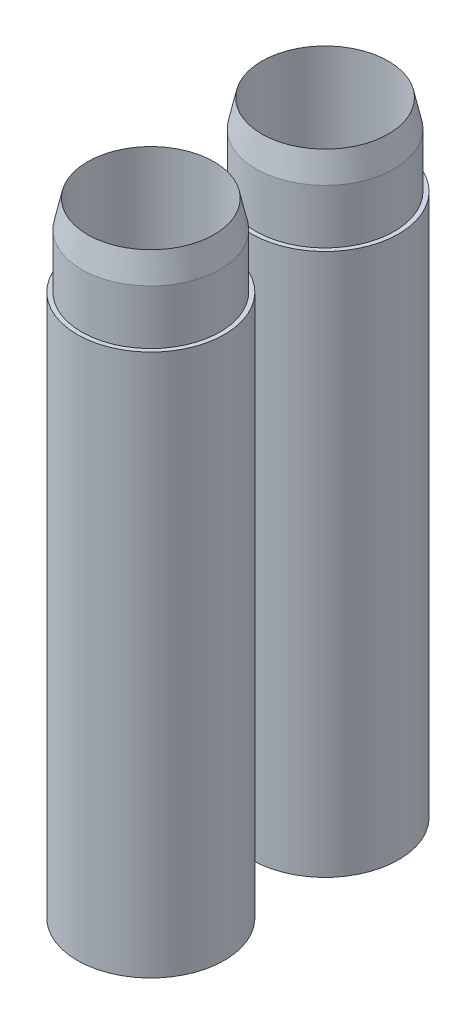
ISO-10303-21;
HEADER;
FILE_DESCRIPTION(('STEP AP214'),'2;1');
FILE_NAME('part.step','',(''),(''),'','','');
FILE_SCHEMA(('AUTOMOTIVE_DESIGN { 1 0 10303 214 1 1 1 1 }'));
ENDSEC;
DATA;
#1=APPLICATION_CONTEXT('core data for automotive mechanical design processes');
#2=APPLICATION_PROTOCOL_DEFINITION('international standard','automotive_design',2000,#1);
#3=PRODUCT_CONTEXT('',#1,'mechanical');
#4=PRODUCT('Part','Part','',(#3));
#5=PRODUCT_RELATED_PRODUCT_CATEGORY('part','',(#4));
#6=PRODUCT_DEFINITION_FORMATION('','',#4);
#7=PRODUCT_DEFINITION_CONTEXT('part definition',#1,'design');
#8=PRODUCT_DEFINITION('design','',#6,#7);
#9=PRODUCT_DEFINITION_SHAPE('','',#8);
#10=(LENGTH_UNIT() NAMED_UNIT(*) SI_UNIT(.MILLI.,.METRE.));
#11=(NAMED_UNIT(*) PLANE_ANGLE_UNIT() SI_UNIT($,.RADIAN.));
#12=(NAMED_UNIT(*) SI_UNIT($,.STERADIAN.) SOLID_ANGLE_UNIT());
#13=UNCERTAINTY_MEASURE_WITH_UNIT(LENGTH_MEASURE(1.E-05),#10,'distance_accuracy_value','');
#14=(GEOMETRIC_REPRESENTATION_CONTEXT(3) GLOBAL_UNCERTAINTY_ASSIGNED_CONTEXT((#13)) GLOBAL_UNIT_ASSIGNED_CONTEXT((#10,
#11,#12)) REPRESENTATION_CONTEXT('',''));
#15=CARTESIAN_POINT('',(0.,0.,0.));
#16=DIRECTION('',(0.,0.,1.));
#17=DIRECTION('',(1.,0.,0.));
#18=AXIS2_PLACEMENT_3D('',#15,#16,#17);
#19=CARTESIAN_POINT('',(0.,190.,64.3));
#20=DIRECTION('',(0.,-1.,0.));
#21=DIRECTION('',(0.,0.,-1.));
#22=AXIS2_PLACEMENT_3D('',#19,#20,#21);
#23=CONICAL_SURFACE('',#22,25.55,0.785398163397442);
#24=CARTESIAN_POINT('',(0.,192.216946626429,64.3));
#25=DIRECTION('',(0.,1.,0.));
#26=DIRECTION('',(0.,0.,1.));
#27=AXIS2_PLACEMENT_3D('',#24,#25,#26);
#28=CIRCLE('',#27,23.3330533735706);
#29=CARTESIAN_POINT('',(0.,192.216946626429,87.6330533735706));
#30=VERTEX_POINT('',#29);
#31=EDGE_CURVE('E197',#30,#30,#28,.T.);
#32=ORIENTED_EDGE('',*,*,#31,.T.);
#33=EDGE_LOOP('',(#32));
#34=FACE_BOUND('',#33,.T.);
#35=CARTESIAN_POINT('',(0.,190.,64.3));
#36=DIRECTION('',(0.,1.,0.));
#37=DIRECTION('',(0.,0.,1.));
#38=AXIS2_PLACEMENT_3D('',#35,#36,#37);
#39=CIRCLE('',#38,25.55);
#40=CARTESIAN_POINT('',(-25.4273966422046,190.,66.8));
#41=VERTEX_POINT('',#40);
#42=CARTESIAN_POINT('',(-25.4273966422046,190.,61.8));
#43=VERTEX_POINT('',#42);
#44=EDGE_CURVE('E138',#41,#43,#39,.T.);
#45=ORIENTED_EDGE('',*,*,#44,.F.);
#46=CARTESIAN_POINT('',(-25.4273966422046,188.902903047183,72.26964716991));
#47=CARTESIAN_POINT('',(-25.4273966422046,188.998251798577,71.9508442386737));
#48=CARTESIAN_POINT('',(-25.4273966422046,189.088812689919,71.6306211801287));
#49=CARTESIAN_POINT('',(-25.4273966422046,189.259738025385,70.9874172579031));
#50=CARTESIAN_POINT('',(-25.4273966422046,189.34010094631,70.6644359899196));
#51=CARTESIAN_POINT('',(-25.4273966422046,189.565037974838,69.6911145196233));
#52=CARTESIAN_POINT('',(-25.4273966422046,189.693309121119,69.0368960064844));
#53=CARTESIAN_POINT('',(-25.4273966422046,189.899452039229,67.7353657496107));
#54=CARTESIAN_POINT('',(-25.4273966422046,189.978375353384,67.0882210728148));
#55=CARTESIAN_POINT('',(-25.4273966422046,190.087187129171,65.7900744959824));
#56=CARTESIAN_POINT('',(-25.4273966422046,190.11709907209,65.1390745931074));
#57=CARTESIAN_POINT('',(-25.4273966422046,190.126945164412,63.8061271509909));
#58=CARTESIAN_POINT('',(-25.4273966422046,190.104467462811,63.1241613114666));
#59=CARTESIAN_POINT('',(-25.4273966422046,190.005441144313,61.7637745195394));
#60=CARTESIAN_POINT('',(-25.4273966422046,189.928862272532,61.0853557647204));
#61=CARTESIAN_POINT('',(-25.4273966422046,189.774722966391,60.0657081209359));
#62=CARTESIAN_POINT('',(-25.4273966422046,189.715885777427,59.7215238811375));
#63=CARTESIAN_POINT('',(-25.4273966422046,189.585527579423,59.0355305120838));
#64=CARTESIAN_POINT('',(-25.4273966422046,189.514005871046,58.6937215148634));
#65=CARTESIAN_POINT('',(-25.4273966422046,189.359036728492,58.0132099410383));
#66=CARTESIAN_POINT('',(-25.4273966422046,189.275601844734,57.6745044895207));
#67=CARTESIAN_POINT('',(-25.4273966422046,189.097496975017,57.0001191046407));
#68=CARTESIAN_POINT('',(-25.4273966422046,189.002828924501,56.6644386607705));
#69=CARTESIAN_POINT('',(-25.4273966422046,188.902903047182,56.33035283009));
#70=B_SPLINE_CURVE_WITH_KNOTS('',3,(#46,#47,#48,#49,#50,#51,#52,#53,#54,#55,#56,#57,#58,#59,#60,
#61,#62,#63,#64,#65,#66,#67,#68,#69),.UNSPECIFIED.,.F.,.F.,(4,2,2,2,2,2,2,2,2,2,2,4),(0.,
0.998198099225915,1.99654511711352,3.99480140925886,5.94887992829263,7.9020219767311,
9.94684401303355,11.9928104770004,13.040144194806,14.0875356733794,15.133831766334,
16.179947846412),.UNSPECIFIED.);
#71=EDGE_CURVE('E139',#41,#43,#70,.T.);
#72=ORIENTED_EDGE('',*,*,#71,.T.);
#73=EDGE_LOOP('',(#45,#72));
#74=FACE_BOUND('',#73,.T.);
#75=ADVANCED_FACE('F54',(#34,#74),#23,.F.);
#76=CARTESIAN_POINT('',(0.,200.,64.3));
#77=DIRECTION('',(0.,1.,0.));
#78=DIRECTION('',(0.,0.,1.));
#79=AXIS2_PLACEMENT_3D('',#76,#77,#78);
#80=CYLINDRICAL_SURFACE('',#79,25.55);
#81=CARTESIAN_POINT('',(0.,200.,64.3));
#82=DIRECTION('',(0.,1.,0.));
#83=DIRECTION('',(0.,0.,1.));
#84=AXIS2_PLACEMENT_3D('',#81,#82,#83);
#85=CIRCLE('',#84,25.55);
#86=CARTESIAN_POINT('',(-25.4273966422046,200.,66.8));
#87=VERTEX_POINT('',#86);
#88=CARTESIAN_POINT('',(-25.4273966422046,200.,61.8));
#89=VERTEX_POINT('',#88);
#90=EDGE_CURVE('E122',#87,#89,#85,.T.);
#91=ORIENTED_EDGE('',*,*,#90,.T.);
#92=DIRECTION('',(0.,-1.,0.));
#93=VECTOR('',#92,1.);
#94=CARTESIAN_POINT('',(-25.4273966422046,230.,61.8));
#95=LINE('',#94,#93);
#96=CARTESIAN_POINT('',(-25.4273966422046,220.,61.8));
#97=VERTEX_POINT('',#96);
#98=EDGE_CURVE('E159',#97,#89,#95,.T.);
#99=ORIENTED_EDGE('',*,*,#98,.F.);
#100=CARTESIAN_POINT('',(0.,220.,64.3));
#101=DIRECTION('',(0.,1.,0.));
#102=DIRECTION('',(0.,0.,1.));
#103=AXIS2_PLACEMENT_3D('',#100,#101,#102);
#104=CIRCLE('',#103,25.55);
#105=CARTESIAN_POINT('',(-25.4273966422046,220.,66.8));
#106=VERTEX_POINT('',#105);
#107=EDGE_CURVE('E141',#106,#97,#104,.T.);
#108=ORIENTED_EDGE('',*,*,#107,.F.);
#109=DIRECTION('',(0.,-1.,0.));
#110=VECTOR('',#109,1.);
#111=CARTESIAN_POINT('',(-25.4273966422046,230.,66.8));
#112=LINE('',#111,#110);
#113=EDGE_CURVE('E75',#106,#87,#112,.T.);
#114=ORIENTED_EDGE('',*,*,#113,.T.);
#115=EDGE_LOOP('',(#91,#99,#108,#114));
#116=FACE_BOUND('',#115,.T.);
#117=ADVANCED_FACE('F166',(#116),#80,.T.);
#118=CARTESIAN_POINT('',(0.,230.,64.3));
#119=DIRECTION('',(0.,-1.,0.));
#120=DIRECTION('',(0.,0.,-1.));
#121=AXIS2_PLACEMENT_3D('',#118,#119,#120);
#122=CONICAL_SURFACE('',#121,23.3330533735706,0.218166156499292);
#123=CARTESIAN_POINT('',(0.,230.,64.3));
#124=DIRECTION('',(0.,1.,0.));
#125=DIRECTION('',(0.,0.,1.));
#126=AXIS2_PLACEMENT_3D('',#123,#124,#125);
#127=CIRCLE('',#126,23.3330533735706);
#128=CARTESIAN_POINT('',(0.,230.,87.6330533735706));
#129=VERTEX_POINT('',#128);
#130=EDGE_CURVE('E144',#129,#129,#127,.T.);
#131=ORIENTED_EDGE('',*,*,#130,.F.);
#132=EDGE_LOOP('',(#131));
#133=FACE_BOUND('',#132,.T.);
#134=ORIENTED_EDGE('',*,*,#107,.T.);
#135=CARTESIAN_POINT('',(-25.4273966422046,208.819460112501,52.5079001540006));
#136=CARTESIAN_POINT('',(-25.4273966422046,209.231793745191,52.7252426014775));
#137=CARTESIAN_POINT('',(-25.4273966422046,209.642170605036,52.9463729937552));
#138=CARTESIAN_POINT('',(-25.4273966422046,210.458196808742,53.3975618815708));
#139=CARTESIAN_POINT('',(-25.4273966422046,210.863844173489,53.627623951805));
#140=CARTESIAN_POINT('',(-25.4273966422046,211.675240890613,54.1013451512785));
#141=CARTESIAN_POINT('',(-25.4273966422046,212.080902351888,54.345155435368));
#142=CARTESIAN_POINT('',(-25.4273966422046,212.88465079662,54.8448560687002));
#143=CARTESIAN_POINT('',(-25.4273966422046,213.282738995373,55.1007444564093));
#144=CARTESIAN_POINT('',(-25.4273966422046,214.096057131137,55.6445512310602));
#145=CARTESIAN_POINT('',(-25.4273966422046,214.510625097653,55.9334653861569));
#146=CARTESIAN_POINT('',(-25.4273966422046,215.325749830031,56.5309764501056));
#147=CARTESIAN_POINT('',(-25.4273966422046,215.726299918052,56.8395825473773));
#148=CARTESIAN_POINT('',(-25.4273966422046,216.505536213056,57.4785884679983));
#149=CARTESIAN_POINT('',(-25.4273966422046,216.88434455372,57.8088383005781));
#150=CARTESIAN_POINT('',(-25.4273966422046,217.61472894555,58.4979601168823));
#151=CARTESIAN_POINT('',(-25.4273966422046,217.966338224169,58.8567960544623));
#152=CARTESIAN_POINT('',(-25.4273966422046,218.44488589626,59.3997326627034));
#153=CARTESIAN_POINT('',(-25.4273966422046,218.58782846401,59.5697635809317));
#154=CARTESIAN_POINT('',(-25.4273966422046,218.86440976868,59.9173794852809));
#155=CARTESIAN_POINT('',(-25.4273966422046,218.99804498124,60.0949672923557));
#156=CARTESIAN_POINT('',(-25.4273966422046,219.253340816494,60.4571154159408));
#157=CARTESIAN_POINT('',(-25.4273966422046,219.375065037169,60.6416304905465));
#158=CARTESIAN_POINT('',(-25.4273966422046,219.605079674763,61.0187600634294));
#159=CARTESIAN_POINT('',(-25.4273966422046,219.713373014905,61.2113727869956));
#160=CARTESIAN_POINT('',(-25.4273966422046,219.979391378116,61.7333928912405));
#161=CARTESIAN_POINT('',(-25.4273966422046,220.123367555479,62.0701817390596));
#162=CARTESIAN_POINT('',(-25.4273966422046,220.296422108232,62.589392047031));
#163=CARTESIAN_POINT('',(-25.4273966422046,220.346957808694,62.7648154786717));
#164=CARTESIAN_POINT('',(-25.4273966422046,220.432243280876,63.1194286135191));
#165=CARTESIAN_POINT('',(-25.4273966422046,220.467001394852,63.2986162738603));
#166=CARTESIAN_POINT('',(-25.4273966422046,220.519764045477,63.6611025541308));
#167=CARTESIAN_POINT('',(-25.4273966422046,220.537615273654,63.8444236437127));
#168=CARTESIAN_POINT('',(-25.4273966422046,220.55533406069,64.2119366587753));
#169=CARTESIAN_POINT('',(-25.4273966422046,220.555202254837,64.3961285532632));
#170=CARTESIAN_POINT('',(-25.4273966422046,220.536958020151,64.7636368387221));
#171=CARTESIAN_POINT('',(-25.4273966422046,220.518843135701,64.9469531066897));
#172=CARTESIAN_POINT('',(-25.4273966422046,220.46532200331,65.3111130441243));
#173=CARTESIAN_POINT('',(-25.4273966422046,220.429906525614,65.491955340744));
#174=CARTESIAN_POINT('',(-25.4273966422046,220.338947724871,65.8665322814097));
#175=CARTESIAN_POINT('',(-25.4273966422046,220.281826361209,66.059882520668));
#176=CARTESIAN_POINT('',(-25.4273966422046,220.150461713357,66.4407263569215));
#177=CARTESIAN_POINT('',(-25.4273966422046,220.076206997473,66.6282159483201));
#178=CARTESIAN_POINT('',(-25.4273966422046,219.831014742072,67.1810213187615));
#179=CARTESIAN_POINT('',(-25.4273966422046,219.637695057707,67.5364989216491));
#180=CARTESIAN_POINT('',(-25.4273966422046,219.240368565429,68.1687271106567));
#181=CARTESIAN_POINT('',(-25.4273966422046,219.042237098603,68.4493196166936));
#182=CARTESIAN_POINT('',(-25.4273966422046,218.622466722845,68.9925860946242));
#183=CARTESIAN_POINT('',(-25.4273966422046,218.400808820089,69.2552453027995));
#184=CARTESIAN_POINT('',(-25.4273966422046,217.938095131352,69.7663158869257));
#185=CARTESIAN_POINT('',(-25.4273966422046,217.696905354673,70.0146045245757));
#186=CARTESIAN_POINT('',(-25.4273966422046,217.200847738056,70.4968219484599));
#187=CARTESIAN_POINT('',(-25.4273966422046,216.945985099359,70.7307561236339));
#188=CARTESIAN_POINT('',(-25.4273966422046,216.384394780086,71.2222366628454));
#189=CARTESIAN_POINT('',(-25.4273966422046,216.07583284126,71.4776772822824));
#190=CARTESIAN_POINT('',(-25.4273966422046,215.447551751195,71.974520989929));
#191=CARTESIAN_POINT('',(-25.4273966422046,215.127829697313,72.2159203819535));
#192=CARTESIAN_POINT('',(-25.4273966422046,214.479105417977,72.6870397732365));
#193=CARTESIAN_POINT('',(-25.4273966422046,214.150088435994,72.9167393658902));
#194=CARTESIAN_POINT('',(-25.4273966422046,213.485000182244,73.3656974286047));
#195=CARTESIAN_POINT('',(-25.4273966422046,213.148928436298,73.5849551935689));
#196=CARTESIAN_POINT('',(-25.4273966422046,212.48520653015,74.0053962613971));
#197=CARTESIAN_POINT('',(-25.4273966422046,212.157791518957,74.206951981186));
#198=CARTESIAN_POINT('',(-25.4273966422046,211.498530841803,74.6027048837517));
#199=CARTESIAN_POINT('',(-25.4273966422046,211.166684956716,74.7969017007604));
#200=CARTESIAN_POINT('',(-25.4273966422046,210.50071930374,75.1779251675523));
#201=CARTESIAN_POINT('',(-25.4273966422046,210.166615783788,75.3647802877164));
#202=CARTESIAN_POINT('',(-25.4273966422046,209.495274208624,75.7326472787385));
#203=CARTESIAN_POINT('',(-25.4273966422046,209.158036665031,75.9136600824813));
#204=CARTESIAN_POINT('',(-25.4273966422046,208.819460112501,76.0920998459994));
#205=B_SPLINE_CURVE_WITH_KNOTS('',3,(#135,#136,#137,#138,#139,#140,#141,#142,#143,#144,#145,
#146,#147,#148,#149,#150,#151,#152,#153,#154,#155,#156,#157,#158,#159,#160,#161,#162,#163,#164,
#165,#166,#167,#168,#169,#170,#171,#172,#173,#174,#175,#176,#177,#178,#179,#180,#181,#182,#183,
#184,#185,#186,#187,#188,#189,#190,#191,#192,#193,#194,#195,#196,#197,#198,#199,#200,#201,#202,
#203,#204),.UNSPECIFIED.,.F.,.F.,(4,2,2,2,2,2,2,2,2,2,2,2,2,2,2,2,2,2,2,2,2,2,2,2,2,2,2,2,2,2,2,
2,2,2,4),(0.,1.3983570027456,2.79727955459048,4.21697039639872,5.63643146261191,
7.15190938526876,8.66809968768579,10.1747119189342,11.6794535517914,12.3455941835613,
13.0119857024623,13.6745988909515,14.337067608069,15.4310496657533,15.9781336003992,
16.5249279314542,17.0766343143879,17.6283212072033,18.1800834441228,18.7321403646474,
19.3360477869135,19.9403593187228,21.1495176422229,22.1786695471399,23.2086587399318,
24.2464353729418,25.283819990551,26.485039964043,27.6865747264528,28.8901380603362,
30.0937825513221,31.2471163364763,32.4005073721034,33.5488639215576,34.6970361882325),.UNSPECIFIED.);
#206=EDGE_CURVE('E12',#97,#106,#205,.T.);
#207=ORIENTED_EDGE('',*,*,#206,.T.);
#208=EDGE_LOOP('',(#134,#207));
#209=FACE_BOUND('',#208,.T.);
#210=ADVANCED_FACE('F169',(#133,#209),#122,.T.);
#211=CARTESIAN_POINT('',(0.,200.,64.3));
#212=DIRECTION('',(0.,-1.,0.));
#213=DIRECTION('',(0.,0.,-1.));
#214=AXIS2_PLACEMENT_3D('',#211,#212,#213);
#215=CYLINDRICAL_SURFACE('',#214,25.55);
#216=ORIENTED_EDGE('',*,*,#44,.T.);
#217=DIRECTION('',(0.,-1.,0.));
#218=VECTOR('',#217,1.);
#219=CARTESIAN_POINT('',(-25.4273966422046,200.,61.8));
#220=LINE('',#219,#218);
#221=CARTESIAN_POINT('',(-25.4273966422046,0.,61.8));
#222=VERTEX_POINT('',#221);
#223=EDGE_CURVE('E127',#43,#222,#220,.T.);
#224=ORIENTED_EDGE('',*,*,#223,.T.);
#225=CARTESIAN_POINT('',(0.,0.,64.3));
#226=DIRECTION('',(0.,1.,0.));
#227=DIRECTION('',(0.,0.,1.));
#228=AXIS2_PLACEMENT_3D('',#225,#226,#227);
#229=CIRCLE('',#228,25.55);
#230=CARTESIAN_POINT('',(-25.4273966422046,0.,66.8));
#231=VERTEX_POINT('',#230);
#232=EDGE_CURVE('E115',#231,#222,#229,.T.);
#233=ORIENTED_EDGE('',*,*,#232,.F.);
#234=DIRECTION('',(0.,-1.,0.));
#235=VECTOR('',#234,1.);
#236=CARTESIAN_POINT('',(-25.4273966422046,200.,66.8));
#237=LINE('',#236,#235);
#238=EDGE_CURVE('E104',#41,#231,#237,.T.);
#239=ORIENTED_EDGE('',*,*,#238,.F.);
#240=EDGE_LOOP('',(#216,#224,#233,#239));
#241=FACE_BOUND('',#240,.T.);
#242=ADVANCED_FACE('F56',(#241),#215,.F.);
#243=CARTESIAN_POINT('',(-20.9003194639063,200.,75.3571330807833));
#244=DIRECTION('',(0.883923273701337,0.,-0.467631955932345));
#245=DIRECTION('',(-0.467631955932345,0.,-0.883923273701337));
#246=AXIS2_PLACEMENT_3D('',#243,#244,#245);
#247=PLANE('',#246);
#248=DIRECTION('',(0.467631955932345,0.,0.883923273701337));
#249=VECTOR('',#248,1.);
#250=CARTESIAN_POINT('',(-20.9003194639063,0.,75.3571330807833));
#251=LINE('',#250,#249);
#252=CARTESIAN_POINT('',(-26.75,0.,64.3));
#253=VERTEX_POINT('',#252);
#254=EDGE_CURVE('E108',#253,#231,#251,.T.);
#255=ORIENTED_EDGE('',*,*,#254,.F.);
#256=DIRECTION('',(0.,-1.,0.));
#257=VECTOR('',#256,1.);
#258=CARTESIAN_POINT('',(-26.75,200.,64.3));
#259=LINE('',#258,#257);
#260=CARTESIAN_POINT('',(-26.75,200.,64.3));
#261=VERTEX_POINT('',#260);
#262=EDGE_CURVE('E83',#261,#253,#259,.T.);
#263=ORIENTED_EDGE('',*,*,#262,.F.);
#264=DIRECTION('',(0.467631955932345,0.,0.883923273701337));
#265=VECTOR('',#264,1.);
#266=CARTESIAN_POINT('',(-20.9003194639063,200.,75.3571330807833));
#267=LINE('',#266,#265);
#268=EDGE_CURVE('E131',#261,#87,#267,.T.);
#269=ORIENTED_EDGE('',*,*,#268,.T.);
#270=EDGE_CURVE('E68',#87,#41,#237,.T.);
#271=ORIENTED_EDGE('',*,*,#270,.T.);
#272=ORIENTED_EDGE('',*,*,#238,.T.);
#273=EDGE_LOOP('',(#255,#263,#269,#271,#272));
#274=FACE_BOUND('',#273,.T.);
#275=ADVANCED_FACE('F109',(#274),#247,.T.);
#276=CARTESIAN_POINT('',(-20.9003194639063,200.,53.2428669192167));
#277=DIRECTION('',(0.883923273701339,0.,0.467631955932343));
#278=DIRECTION('',(0.467631955932343,0.,-0.883923273701339));
#279=AXIS2_PLACEMENT_3D('',#276,#277,#278);
#280=PLANE('',#279);
#281=DIRECTION('',(-0.467631955932343,0.,0.883923273701338));
#282=VECTOR('',#281,1.);
#283=CARTESIAN_POINT('',(-20.9003194639063,0.,53.2428669192167));
#284=LINE('',#283,#282);
#285=EDGE_CURVE('E100',#222,#253,#284,.T.);
#286=ORIENTED_EDGE('',*,*,#285,.F.);
#287=ORIENTED_EDGE('',*,*,#223,.F.);
#288=EDGE_CURVE('E105',#89,#43,#220,.T.);
#289=ORIENTED_EDGE('',*,*,#288,.F.);
#290=DIRECTION('',(-0.467631955932343,0.,0.883923273701338));
#291=VECTOR('',#290,1.);
#292=CARTESIAN_POINT('',(-20.9003194639063,200.,53.2428669192167));
#293=LINE('',#292,#291);
#294=EDGE_CURVE('E103',#89,#261,#293,.T.);
#295=ORIENTED_EDGE('',*,*,#294,.T.);
#296=ORIENTED_EDGE('',*,*,#262,.T.);
#297=EDGE_LOOP('',(#286,#287,#289,#295,#296));
#298=FACE_BOUND('',#297,.T.);
#299=ADVANCED_FACE('F97',(#298),#280,.T.);
#300=CARTESIAN_POINT('',(0.,200.,64.3));
#301=DIRECTION('',(0.,-1.,0.));
#302=DIRECTION('',(0.,0.,-1.));
#303=AXIS2_PLACEMENT_3D('',#300,#301,#302);
#304=CYLINDRICAL_SURFACE('',#303,27.15);
#305=CARTESIAN_POINT('',(0.,200.,64.3));
#306=DIRECTION('',(0.,1.,0.));
#307=DIRECTION('',(0.,0.,1.));
#308=AXIS2_PLACEMENT_3D('',#305,#306,#307);
#309=CIRCLE('',#308,27.15);
#310=CARTESIAN_POINT('',(0.,200.,91.45));
#311=VERTEX_POINT('',#310);
#312=EDGE_CURVE('E152',#311,#311,#309,.T.);
#313=ORIENTED_EDGE('',*,*,#312,.F.);
#314=EDGE_LOOP('',(#313));
#315=FACE_BOUND('',#314,.T.);
#316=CARTESIAN_POINT('',(0.,0.,64.3));
#317=DIRECTION('',(0.,1.,0.));
#318=DIRECTION('',(0.,0.,1.));
#319=AXIS2_PLACEMENT_3D('',#316,#317,#318);
#320=CIRCLE('',#319,27.15);
#321=CARTESIAN_POINT('',(0.,0.,91.45));
#322=VERTEX_POINT('',#321);
#323=EDGE_CURVE('E119',#322,#322,#320,.T.);
#324=ORIENTED_EDGE('',*,*,#323,.T.);
#325=EDGE_LOOP('',(#324));
#326=FACE_BOUND('',#325,.T.);
#327=ADVANCED_FACE('F213',(#315,#326),#304,.T.);
#328=CARTESIAN_POINT('',(0.,200.,64.3));
#329=DIRECTION('',(0.,1.,0.));
#330=DIRECTION('',(0.,0.,1.));
#331=AXIS2_PLACEMENT_3D('',#328,#329,#330);
#332=PLANE('',#331);
#333=ORIENTED_EDGE('',*,*,#90,.F.);
#334=ORIENTED_EDGE('',*,*,#268,.F.);
#335=ORIENTED_EDGE('',*,*,#294,.F.);
#336=EDGE_LOOP('',(#333,#334,#335));
#337=FACE_BOUND('',#336,.T.);
#338=ORIENTED_EDGE('',*,*,#312,.T.);
#339=EDGE_LOOP('',(#338));
#340=FACE_BOUND('',#339,.T.);
#341=ADVANCED_FACE('F188',(#337,#340),#332,.T.);
#342=CARTESIAN_POINT('',(0.,0.,64.3));
#343=DIRECTION('',(0.,1.,0.));
#344=DIRECTION('',(0.,0.,1.));
#345=AXIS2_PLACEMENT_3D('',#342,#343,#344);
#346=PLANE('',#345);
#347=ORIENTED_EDGE('',*,*,#232,.T.);
#348=ORIENTED_EDGE('',*,*,#285,.T.);
#349=ORIENTED_EDGE('',*,*,#254,.T.);
#350=EDGE_LOOP('',(#347,#348,#349));
#351=FACE_BOUND('',#350,.T.);
#352=ORIENTED_EDGE('',*,*,#323,.F.);
#353=EDGE_LOOP('',(#352));
#354=FACE_BOUND('',#353,.T.);
#355=ADVANCED_FACE('F117',(#351,#354),#346,.F.);
#356=CARTESIAN_POINT('',(0.,200.,64.3));
#357=DIRECTION('',(0.,1.,0.));
#358=DIRECTION('',(0.,0.,1.));
#359=AXIS2_PLACEMENT_3D('',#356,#357,#358);
#360=CYLINDRICAL_SURFACE('',#359,23.3330533735706);
#361=ORIENTED_EDGE('',*,*,#130,.T.);
#362=EDGE_LOOP('',(#361));
#363=FACE_BOUND('',#362,.T.);
#364=ORIENTED_EDGE('',*,*,#31,.F.);
#365=EDGE_LOOP('',(#364));
#366=FACE_BOUND('',#365,.T.);
#367=ADVANCED_FACE('F200',(#363,#366),#360,.F.);
#368=CARTESIAN_POINT('',(-25.4273966422046,230.,64.3));
#369=DIRECTION('',(-1.,0.,0.));
#370=DIRECTION('',(0.,0.,1.));
#371=AXIS2_PLACEMENT_3D('',#368,#369,#370);
#372=PLANE('',#371);
#373=ORIENTED_EDGE('',*,*,#270,.F.);
#374=ORIENTED_EDGE('',*,*,#113,.F.);
#375=ORIENTED_EDGE('',*,*,#206,.F.);
#376=ORIENTED_EDGE('',*,*,#98,.T.);
#377=ORIENTED_EDGE('',*,*,#288,.T.);
#378=ORIENTED_EDGE('',*,*,#71,.F.);
#379=EDGE_LOOP('',(#373,#374,#375,#376,#377,#378));
#380=FACE_BOUND('',#379,.T.);
#381=ADVANCED_FACE('F162',(#380),#372,.T.);
#382=CLOSED_SHELL('',(#75,#117,#210,#242,#275,#299,#327,#341,#355,#367,#381));
#383=MANIFOLD_SOLID_BREP('B2',#382);
#384=CARTESIAN_POINT('',(0.,200.,0.));
#385=DIRECTION('',(0.,-1.,0.));
#386=DIRECTION('',(0.,0.,-1.));
#387=AXIS2_PLACEMENT_3D('',#384,#385,#386);
#388=CYLINDRICAL_SURFACE('',#387,25.55);
#389=CARTESIAN_POINT('',(0.,0.,0.));
#390=DIRECTION('',(0.,-1.,0.));
#391=DIRECTION('',(0.,0.,-1.));
#392=AXIS2_PLACEMENT_3D('',#389,#390,#391);
#393=CIRCLE('',#392,25.55);
#394=CARTESIAN_POINT('',(-25.112748364371,0.,4.70663038572003));
#395=VERTEX_POINT('',#394);
#396=CARTESIAN_POINT('',(-25.4273966422046,0.,2.5));
#397=VERTEX_POINT('',#396);
#398=EDGE_CURVE('E52',#395,#397,#393,.T.);
#399=ORIENTED_EDGE('',*,*,#398,.F.);
#400=DIRECTION('',(0.,1.,0.));
#401=VECTOR('',#400,1.);
#402=CARTESIAN_POINT('',(-25.112748364371,27.320508075689,4.70663038572003));
#403=LINE('',#402,#401);
#404=CARTESIAN_POINT('',(-25.112748364371,27.320508075689,4.70663038572003));
#405=VERTEX_POINT('',#404);
#406=EDGE_CURVE('E378',#395,#405,#403,.T.);
#407=ORIENTED_EDGE('',*,*,#406,.T.);
#408=CARTESIAN_POINT('',(0.,27.320508075689,0.));
#409=DIRECTION('',(0.,-1.,0.));
#410=DIRECTION('',(0.,0.,-1.));
#411=AXIS2_PLACEMENT_3D('',#408,#409,#410);
#412=CIRCLE('',#411,25.55);
#413=CARTESIAN_POINT('',(-25.4273966422046,27.320508075689,2.5));
#414=VERTEX_POINT('',#413);
#415=EDGE_CURVE('E373',#405,#414,#412,.T.);
#416=ORIENTED_EDGE('',*,*,#415,.T.);
#417=DIRECTION('',(0.,1.,0.));
#418=VECTOR('',#417,1.);
#419=CARTESIAN_POINT('',(-25.4273966422046,27.320508075689,2.5));
#420=LINE('',#419,#418);
#421=EDGE_CURVE('E376',#397,#414,#420,.T.);
#422=ORIENTED_EDGE('',*,*,#421,.F.);
#423=EDGE_LOOP('',(#399,#407,#416,#422));
#424=FACE_BOUND('',#423,.T.);
#425=ADVANCED_FACE('F337',(#424),#388,.T.);
#426=CARTESIAN_POINT('',(0.,8.66025403784451,0.));
#427=DIRECTION('',(0.,-1.,0.));
#428=DIRECTION('',(0.,0.,-1.));
#429=AXIS2_PLACEMENT_3D('',#426,#427,#428);
#430=CONICAL_SURFACE('',#429,20.55,0.523598775598292);
#431=CARTESIAN_POINT('',(0.,8.66025403784451,0.));
#432=DIRECTION('',(0.,-1.,0.));
#433=DIRECTION('',(0.,0.,-1.));
#434=AXIS2_PLACEMENT_3D('',#431,#432,#433);
#435=CIRCLE('',#434,20.55);
#436=CARTESIAN_POINT('',(-20.198316199132,8.6602540378445,3.78556768792746));
#437=VERTEX_POINT('',#436);
#438=CARTESIAN_POINT('',(-20.4513894715188,8.6602540378445,2.01076320939335));
#439=VERTEX_POINT('',#438);
#440=EDGE_CURVE('E345',#437,#439,#435,.T.);
#441=ORIENTED_EDGE('',*,*,#440,.F.);
#442=DIRECTION('',(-0.491443216523889,-0.866025403784442,0.0921062697792559));
#443=VECTOR('',#442,1.);
#444=CARTESIAN_POINT('',(-25.112748364371,0.,4.70663038572003));
#445=LINE('',#444,#443);
#446=EDGE_CURVE('E383',#437,#395,#445,.T.);
#447=ORIENTED_EDGE('',*,*,#446,.T.);
#448=ORIENTED_EDGE('',*,*,#398,.T.);
#449=DIRECTION('',(-0.497600717068579,-0.866025403784442,0.0489236790606649));
#450=VECTOR('',#449,1.);
#451=CARTESIAN_POINT('',(-25.4273966422046,0.,2.5));
#452=LINE('',#451,#450);
#453=EDGE_CURVE('E395',#439,#397,#452,.T.);
#454=ORIENTED_EDGE('',*,*,#453,.F.);
#455=EDGE_LOOP('',(#441,#447,#448,#454));
#456=FACE_BOUND('',#455,.T.);
#457=ADVANCED_FACE('F339',(#456),#430,.F.);
#458=CARTESIAN_POINT('',(0.,200.,0.));
#459=DIRECTION('',(0.,-1.,0.));
#460=DIRECTION('',(0.,0.,-1.));
#461=AXIS2_PLACEMENT_3D('',#458,#459,#460);
#462=CYLINDRICAL_SURFACE('',#461,20.55);
#463=CARTESIAN_POINT('',(0.,18.6602540378445,0.));
#464=DIRECTION('',(0.,-1.,0.));
#465=DIRECTION('',(0.,0.,-1.));
#466=AXIS2_PLACEMENT_3D('',#463,#464,#465);
#467=CIRCLE('',#466,20.55);
#468=CARTESIAN_POINT('',(-20.198316199132,18.6602540378445,3.78556768792746));
#469=VERTEX_POINT('',#468);
#470=CARTESIAN_POINT('',(-20.4513894715188,18.6602540378445,2.01076320939335));
#471=VERTEX_POINT('',#470);
#472=EDGE_CURVE('E382',#469,#471,#467,.T.);
#473=ORIENTED_EDGE('',*,*,#472,.F.);
#474=DIRECTION('',(0.,-1.,0.));
#475=VECTOR('',#474,1.);
#476=CARTESIAN_POINT('',(-20.198316199132,8.6602540378445,3.78556768792746));
#477=LINE('',#476,#475);
#478=EDGE_CURVE('E403',#469,#437,#477,.T.);
#479=ORIENTED_EDGE('',*,*,#478,.T.);
#480=ORIENTED_EDGE('',*,*,#440,.T.);
#481=DIRECTION('',(0.,-1.,0.));
#482=VECTOR('',#481,1.);
#483=CARTESIAN_POINT('',(-20.4513894715188,8.6602540378445,2.01076320939335));
#484=LINE('',#483,#482);
#485=EDGE_CURVE('E391',#471,#439,#484,.T.);
#486=ORIENTED_EDGE('',*,*,#485,.F.);
#487=EDGE_LOOP('',(#473,#479,#480,#486));
#488=FACE_BOUND('',#487,.T.);
#489=ADVANCED_FACE('F407',(#488),#462,.F.);
#490=CARTESIAN_POINT('',(0.,27.320508075689,0.));
#491=DIRECTION('',(0.,1.,0.));
#492=DIRECTION('',(0.,0.,1.));
#493=AXIS2_PLACEMENT_3D('',#490,#491,#492);
#494=CONICAL_SURFACE('',#493,25.55,0.523598775598292);
#495=DIRECTION('',(0.491443216523889,-0.866025403784441,-0.092106269779256));
#496=VECTOR('',#495,1.);
#497=CARTESIAN_POINT('',(-20.198316199132,18.6602540378445,3.78556768792746));
#498=LINE('',#497,#496);
#499=EDGE_CURVE('E401',#405,#469,#498,.T.);
#500=ORIENTED_EDGE('',*,*,#499,.T.);
#501=ORIENTED_EDGE('',*,*,#472,.T.);
#502=DIRECTION('',(0.497600717068579,-0.866025403784441,-0.0489236790606649));
#503=VECTOR('',#502,1.);
#504=CARTESIAN_POINT('',(-20.4513894715188,18.6602540378445,2.01076320939335));
#505=LINE('',#504,#503);
#506=EDGE_CURVE('E386',#414,#471,#505,.T.);
#507=ORIENTED_EDGE('',*,*,#506,.F.);
#508=ORIENTED_EDGE('',*,*,#415,.F.);
#509=EDGE_LOOP('',(#500,#501,#507,#508));
#510=FACE_BOUND('',#509,.T.);
#511=ADVANCED_FACE('F387',(#510),#494,.F.);
#512=CARTESIAN_POINT('',(0.,0.,0.));
#513=DIRECTION('',(0.184212539558514,0.,0.982886433047788));
#514=DIRECTION('',(0.982886433047788,0.,-0.184212539558514));
#515=AXIS2_PLACEMENT_3D('',#512,#513,#514);
#516=PLANE('',#515);
#517=ORIENTED_EDGE('',*,*,#406,.F.);
#518=ORIENTED_EDGE('',*,*,#446,.F.);
#519=ORIENTED_EDGE('',*,*,#478,.F.);
#520=ORIENTED_EDGE('',*,*,#499,.F.);
#521=EDGE_LOOP('',(#517,#518,#519,#520));
#522=FACE_BOUND('',#521,.T.);
#523=ADVANCED_FACE('F411',(#522),#516,.T.);
#524=CARTESIAN_POINT('',(0.,0.,0.));
#525=DIRECTION('',(0.0978473581213308,0.,0.995201434137168));
#526=DIRECTION('',(0.995201434137168,0.,-0.0978473581213308));
#527=AXIS2_PLACEMENT_3D('',#524,#525,#526);
#528=PLANE('',#527);
#529=ORIENTED_EDGE('',*,*,#421,.T.);
#530=ORIENTED_EDGE('',*,*,#506,.T.);
#531=ORIENTED_EDGE('',*,*,#485,.T.);
#532=ORIENTED_EDGE('',*,*,#453,.T.);
#533=EDGE_LOOP('',(#529,#530,#531,#532));
#534=FACE_BOUND('',#533,.T.);
#535=ADVANCED_FACE('F394',(#534),#528,.F.);
#536=CLOSED_SHELL('',(#425,#457,#489,#511,#523,#535));
#537=MANIFOLD_SOLID_BREP('B6',#536);
#538=CARTESIAN_POINT('',(0.,190.,0.));
#539=DIRECTION('',(0.,-1.,0.));
#540=DIRECTION('',(0.,0.,-1.));
#541=AXIS2_PLACEMENT_3D('',#538,#539,#540);
#542=CONICAL_SURFACE('',#541,25.55,0.785398163397442);
#543=CARTESIAN_POINT('',(0.,192.216946626429,0.));
#544=DIRECTION('',(0.,1.,0.));
#545=DIRECTION('',(0.,0.,1.));
#546=AXIS2_PLACEMENT_3D('',#543,#544,#545);
#547=CIRCLE('',#546,23.3330533735706);
#548=CARTESIAN_POINT('',(0.,192.216946626429,23.3330533735706));
#549=VERTEX_POINT('',#548);
#550=EDGE_CURVE('E628',#549,#549,#547,.T.);
#551=ORIENTED_EDGE('',*,*,#550,.T.);
#552=EDGE_LOOP('',(#551));
#553=FACE_BOUND('',#552,.T.);
#554=CARTESIAN_POINT('',(0.,190.,0.));
#555=DIRECTION('',(0.,1.,0.));
#556=DIRECTION('',(0.,0.,1.));
#557=AXIS2_PLACEMENT_3D('',#554,#555,#556);
#558=CIRCLE('',#557,25.55);
#559=CARTESIAN_POINT('',(-25.4273966422046,190.,2.5));
#560=VERTEX_POINT('',#559);
#561=CARTESIAN_POINT('',(-25.4273966422046,190.,-2.5));
#562=VERTEX_POINT('',#561);
#563=EDGE_CURVE('E569',#560,#562,#558,.T.);
#564=ORIENTED_EDGE('',*,*,#563,.F.);
#565=CARTESIAN_POINT('',(-25.4273966422046,188.902903047183,7.96964716991003));
#566=CARTESIAN_POINT('',(-25.4273966422046,188.998251798577,7.6508442386737));
#567=CARTESIAN_POINT('',(-25.4273966422046,189.088812689919,7.33062118012873));
#568=CARTESIAN_POINT('',(-25.4273966422046,189.259738025385,6.68741725790308));
#569=CARTESIAN_POINT('',(-25.4273966422046,189.34010094631,6.36443598991957));
#570=CARTESIAN_POINT('',(-25.4273966422046,189.565037974838,5.39111451962327));
#571=CARTESIAN_POINT('',(-25.4273966422046,189.693309121119,4.73689600648443));
#572=CARTESIAN_POINT('',(-25.4273966422046,189.899452039229,3.4353657496107));
#573=CARTESIAN_POINT('',(-25.4273966422046,189.978375353384,2.78822107281481));
#574=CARTESIAN_POINT('',(-25.4273966422046,190.087187129171,1.49007449598244));
#575=CARTESIAN_POINT('',(-25.4273966422046,190.11709907209,0.839074593107412));
#576=CARTESIAN_POINT('',(-25.4273966422046,190.126945164412,-0.493872849009128));
#577=CARTESIAN_POINT('',(-25.4273966422046,190.104467462811,-1.17583868853334));
#578=CARTESIAN_POINT('',(-25.4273966422046,190.005441144313,-2.53622548046056));
#579=CARTESIAN_POINT('',(-25.4273966422046,189.928862272532,-3.21464423527963));
#580=CARTESIAN_POINT('',(-25.4273966422046,189.774722966391,-4.2342918790641));
#581=CARTESIAN_POINT('',(-25.4273966422046,189.715885777427,-4.5784761188625));
#582=CARTESIAN_POINT('',(-25.4273966422046,189.585527579423,-5.26446948791622));
#583=CARTESIAN_POINT('',(-25.4273966422046,189.514005871046,-5.60627848513664));
#584=CARTESIAN_POINT('',(-25.4273966422046,189.359036728492,-6.28679005896171));
#585=CARTESIAN_POINT('',(-25.4273966422046,189.275601844734,-6.62549551047926));
#586=CARTESIAN_POINT('',(-25.4273966422046,189.097496975017,-7.29988089535928));
#587=CARTESIAN_POINT('',(-25.4273966422046,189.002828924501,-7.63556133922947));
#588=CARTESIAN_POINT('',(-25.4273966422046,188.902903047182,-7.96964716991004));
#589=B_SPLINE_CURVE_WITH_KNOTS('',3,(#565,#566,#567,#568,#569,#570,#571,#572,#573,#574,#575,
#576,#577,#578,#579,#580,#581,#582,#583,#584,#585,#586,#587,#588),.UNSPECIFIED.,.F.,.F.,(4,2,2,
2,2,2,2,2,2,2,2,4),(0.,0.998198099225912,1.99654511711352,3.99480140925886,5.94887992829264,
7.90202197673109,9.94684401303355,11.9928104770004,13.0401441948061,14.0875356733794,
15.133831766334,16.179947846412),.UNSPECIFIED.);
#590=EDGE_CURVE('E570',#560,#562,#589,.T.);
#591=ORIENTED_EDGE('',*,*,#590,.T.);
#592=EDGE_LOOP('',(#564,#591));
#593=FACE_BOUND('',#592,.T.);
#594=ADVANCED_FACE('F485',(#553,#593),#542,.F.);
#595=CARTESIAN_POINT('',(0.,200.,0.));
#596=DIRECTION('',(0.,1.,0.));
#597=DIRECTION('',(0.,0.,1.));
#598=AXIS2_PLACEMENT_3D('',#595,#596,#597);
#599=CYLINDRICAL_SURFACE('',#598,25.55);
#600=CARTESIAN_POINT('',(0.,200.,0.));
#601=DIRECTION('',(0.,1.,0.));
#602=DIRECTION('',(0.,0.,1.));
#603=AXIS2_PLACEMENT_3D('',#600,#601,#602);
#604=CIRCLE('',#603,25.55);
#605=CARTESIAN_POINT('',(-25.4273966422046,200.,2.5));
#606=VERTEX_POINT('',#605);
#607=CARTESIAN_POINT('',(-25.4273966422046,200.,-2.5));
#608=VERTEX_POINT('',#607);
#609=EDGE_CURVE('E553',#606,#608,#604,.T.);
#610=ORIENTED_EDGE('',*,*,#609,.T.);
#611=DIRECTION('',(0.,-1.,0.));
#612=VECTOR('',#611,1.);
#613=CARTESIAN_POINT('',(-25.4273966422046,230.,-2.5));
#614=LINE('',#613,#612);
#615=CARTESIAN_POINT('',(-25.4273966422046,220.,-2.5));
#616=VERTEX_POINT('',#615);
#617=EDGE_CURVE('E590',#616,#608,#614,.T.);
#618=ORIENTED_EDGE('',*,*,#617,.F.);
#619=CARTESIAN_POINT('',(0.,220.,0.));
#620=DIRECTION('',(0.,1.,0.));
#621=DIRECTION('',(0.,0.,1.));
#622=AXIS2_PLACEMENT_3D('',#619,#620,#621);
#623=CIRCLE('',#622,25.55);
#624=CARTESIAN_POINT('',(-25.4273966422046,220.,2.49999999999997));
#625=VERTEX_POINT('',#624);
#626=EDGE_CURVE('E572',#625,#616,#623,.T.);
#627=ORIENTED_EDGE('',*,*,#626,.F.);
#628=DIRECTION('',(0.,-1.,0.));
#629=VECTOR('',#628,1.);
#630=CARTESIAN_POINT('',(-25.4273966422046,230.,2.5));
#631=LINE('',#630,#629);
#632=EDGE_CURVE('E506',#625,#606,#631,.T.);
#633=ORIENTED_EDGE('',*,*,#632,.T.);
#634=EDGE_LOOP('',(#610,#618,#627,#633));
#635=FACE_BOUND('',#634,.T.);
#636=ADVANCED_FACE('F597',(#635),#599,.T.);
#637=CARTESIAN_POINT('',(0.,230.,0.));
#638=DIRECTION('',(0.,-1.,0.));
#639=DIRECTION('',(0.,0.,-1.));
#640=AXIS2_PLACEMENT_3D('',#637,#638,#639);
#641=CONICAL_SURFACE('',#640,23.3330533735706,0.218166156499292);
#642=CARTESIAN_POINT('',(0.,230.,0.));
#643=DIRECTION('',(0.,1.,0.));
#644=DIRECTION('',(0.,0.,1.));
#645=AXIS2_PLACEMENT_3D('',#642,#643,#644);
#646=CIRCLE('',#645,23.3330533735706);
#647=CARTESIAN_POINT('',(0.,230.,23.3330533735706));
#648=VERTEX_POINT('',#647);
#649=EDGE_CURVE('E575',#648,#648,#646,.T.);
#650=ORIENTED_EDGE('',*,*,#649,.F.);
#651=EDGE_LOOP('',(#650));
#652=FACE_BOUND('',#651,.T.);
#653=ORIENTED_EDGE('',*,*,#626,.T.);
#654=CARTESIAN_POINT('',(-25.4273966422046,208.819460112501,-11.7920998459994));
#655=CARTESIAN_POINT('',(-25.4273966422046,209.231793745191,-11.5747573985225));
#656=CARTESIAN_POINT('',(-25.4273966422046,209.642170605036,-11.3536270062448));
#657=CARTESIAN_POINT('',(-25.4273966422046,210.458196808742,-10.9024381184292));
#658=CARTESIAN_POINT('',(-25.4273966422046,210.863844173489,-10.672376048195));
#659=CARTESIAN_POINT('',(-25.4273966422046,211.675240890613,-10.1986548487215));
#660=CARTESIAN_POINT('',(-25.4273966422046,212.080902351888,-9.95484456463198));
#661=CARTESIAN_POINT('',(-25.4273966422046,212.88465079662,-9.45514393129979));
#662=CARTESIAN_POINT('',(-25.4273966422046,213.282738995373,-9.19925554359069));
#663=CARTESIAN_POINT('',(-25.4273966422046,214.096057131137,-8.65544876893983));
#664=CARTESIAN_POINT('',(-25.4273966422046,214.510625097653,-8.3665346138431));
#665=CARTESIAN_POINT('',(-25.4273966422046,215.325749830031,-7.76902354989441));
#666=CARTESIAN_POINT('',(-25.4273966422046,215.726299918052,-7.46041745262267));
#667=CARTESIAN_POINT('',(-25.4273966422046,216.505536213056,-6.82141153200163));
#668=CARTESIAN_POINT('',(-25.4273966422046,216.88434455372,-6.49116169942189));
#669=CARTESIAN_POINT('',(-25.4273966422046,217.61472894555,-5.80203988311771));
#670=CARTESIAN_POINT('',(-25.4273966422046,217.966338224169,-5.44320394553766));
#671=CARTESIAN_POINT('',(-25.4273966422046,218.44488589626,-4.90026733729657));
#672=CARTESIAN_POINT('',(-25.4273966422046,218.58782846401,-4.7302364190683));
#673=CARTESIAN_POINT('',(-25.4273966422046,218.86440976868,-4.38262051471911));
#674=CARTESIAN_POINT('',(-25.4273966422046,218.99804498124,-4.20503270764429));
#675=CARTESIAN_POINT('',(-25.4273966422046,219.253340816494,-3.84288458405923));
#676=CARTESIAN_POINT('',(-25.4273966422046,219.375065037169,-3.65836950945353));
#677=CARTESIAN_POINT('',(-25.4273966422046,219.605079674763,-3.28123993657059));
#678=CARTESIAN_POINT('',(-25.4273966422046,219.713373014905,-3.08862721300444));
#679=CARTESIAN_POINT('',(-25.4273966422046,219.979391378116,-2.56660710875953));
#680=CARTESIAN_POINT('',(-25.4273966422046,220.123367555479,-2.22981826094041));
#681=CARTESIAN_POINT('',(-25.4273966422046,220.296422108232,-1.71060795296899));
#682=CARTESIAN_POINT('',(-25.4273966422046,220.346957808694,-1.53518452132835));
#683=CARTESIAN_POINT('',(-25.4273966422046,220.432243280876,-1.18057138648094));
#684=CARTESIAN_POINT('',(-25.4273966422046,220.467001394852,-1.0013837261397));
#685=CARTESIAN_POINT('',(-25.4273966422046,220.519764045477,-0.638897445869225));
#686=CARTESIAN_POINT('',(-25.4273966422046,220.537615273654,-0.455576356287337));
#687=CARTESIAN_POINT('',(-25.4273966422046,220.55533406069,-0.0880633412247446));
#688=CARTESIAN_POINT('',(-25.4273966422046,220.555202254837,0.0961285532631774));
#689=CARTESIAN_POINT('',(-25.4273966422046,220.536958020151,0.463636838722066));
#690=CARTESIAN_POINT('',(-25.4273966422046,220.518843135701,0.64695310668971));
#691=CARTESIAN_POINT('',(-25.4273966422046,220.46532200331,1.01111304412426));
#692=CARTESIAN_POINT('',(-25.4273966422046,220.429906525614,1.19195534074396));
#693=CARTESIAN_POINT('',(-25.4273966422046,220.338947724871,1.56653228140972));
#694=CARTESIAN_POINT('',(-25.4273966422046,220.281826361209,1.75988252066803));
#695=CARTESIAN_POINT('',(-25.4273966422046,220.150461713357,2.14072635692147));
#696=CARTESIAN_POINT('',(-25.4273966422046,220.076206997473,2.32821594832007));
#697=CARTESIAN_POINT('',(-25.4273966422046,219.831014742072,2.88102131876152));
#698=CARTESIAN_POINT('',(-25.4273966422046,219.637695057707,3.23649892164909));
#699=CARTESIAN_POINT('',(-25.4273966422046,219.240368565429,3.86872711065674));
#700=CARTESIAN_POINT('',(-25.4273966422046,219.042237098603,4.14931961669355));
#701=CARTESIAN_POINT('',(-25.4273966422046,218.622466722845,4.69258609462416));
#702=CARTESIAN_POINT('',(-25.4273966422046,218.400808820089,4.95524530279947));
#703=CARTESIAN_POINT('',(-25.4273966422046,217.938095131352,5.4663158869257));
#704=CARTESIAN_POINT('',(-25.4273966422046,217.696905354673,5.71460452457566));
#705=CARTESIAN_POINT('',(-25.4273966422046,217.200847738056,6.19682194845987));
#706=CARTESIAN_POINT('',(-25.4273966422046,216.945985099359,6.43075612363394));
#707=CARTESIAN_POINT('',(-25.4273966422046,216.384394780086,6.9222366628454));
#708=CARTESIAN_POINT('',(-25.4273966422046,216.07583284126,7.17767728228241));
#709=CARTESIAN_POINT('',(-25.4273966422046,215.447551751195,7.67452098992899));
#710=CARTESIAN_POINT('',(-25.4273966422046,215.127829697313,7.91592038195351));
#711=CARTESIAN_POINT('',(-25.4273966422046,214.479105417977,8.38703977323648));
#712=CARTESIAN_POINT('',(-25.4273966422046,214.150088435994,8.61673936589025));
#713=CARTESIAN_POINT('',(-25.4273966422046,213.485000182244,9.0656974286047));
#714=CARTESIAN_POINT('',(-25.4273966422046,213.148928436298,9.28495519356889));
#715=CARTESIAN_POINT('',(-25.4273966422046,212.48520653015,9.70539626139708));
#716=CARTESIAN_POINT('',(-25.4273966422046,212.157791518957,9.90695198118602));
#717=CARTESIAN_POINT('',(-25.4273966422046,211.498530841803,10.3027048837517));
#718=CARTESIAN_POINT('',(-25.4273966422046,211.166684956716,10.4969017007605));
#719=CARTESIAN_POINT('',(-25.4273966422046,210.50071930374,10.8779251675523));
#720=CARTESIAN_POINT('',(-25.4273966422046,210.166615783788,11.0647802877164));
#721=CARTESIAN_POINT('',(-25.4273966422046,209.495274208624,11.4326472787385));
#722=CARTESIAN_POINT('',(-25.4273966422046,209.158036665031,11.6136600824813));
#723=CARTESIAN_POINT('',(-25.4273966422046,208.819460112501,11.7920998459994));
#724=B_SPLINE_CURVE_WITH_KNOTS('',3,(#654,#655,#656,#657,#658,#659,#660,#661,#662,#663,#664,
#665,#666,#667,#668,#669,#670,#671,#672,#673,#674,#675,#676,#677,#678,#679,#680,#681,#682,#683,
#684,#685,#686,#687,#688,#689,#690,#691,#692,#693,#694,#695,#696,#697,#698,#699,#700,#701,#702,
#703,#704,#705,#706,#707,#708,#709,#710,#711,#712,#713,#714,#715,#716,#717,#718,#719,#720,#721,
#722,#723),.UNSPECIFIED.,.F.,.F.,(4,2,2,2,2,2,2,2,2,2,2,2,2,2,2,2,2,2,2,2,2,2,2,2,2,2,2,2,2,2,2,
2,2,2,4),(0.,1.39835700274557,2.79727955459048,4.21697039639872,5.63643146261191,
7.15190938526876,8.6680996876858,10.1747119189342,11.6794535517914,12.3455941835613,
13.0119857024623,13.6745988909515,14.337067608069,15.4310496657533,15.9781336003992,
16.5249279314542,17.0766343143879,17.6283212072033,18.1800834441228,18.7321403646474,
19.3360477869135,19.9403593187228,21.1495176422229,22.1786695471399,23.2086587399318,
24.2464353729418,25.283819990551,26.485039964043,27.6865747264528,28.8901380603362,
30.0937825513221,31.2471163364763,32.4005073721034,33.5488639215576,34.6970361882325),.UNSPECIFIED.);
#725=EDGE_CURVE('E335',#616,#625,#724,.T.);
#726=ORIENTED_EDGE('',*,*,#725,.T.);
#727=EDGE_LOOP('',(#653,#726));
#728=FACE_BOUND('',#727,.T.);
#729=ADVANCED_FACE('F600',(#652,#728),#641,.T.);
#730=CARTESIAN_POINT('',(0.,200.,0.));
#731=DIRECTION('',(0.,-1.,0.));
#732=DIRECTION('',(0.,0.,-1.));
#733=AXIS2_PLACEMENT_3D('',#730,#731,#732);
#734=CYLINDRICAL_SURFACE('',#733,25.55);
#735=ORIENTED_EDGE('',*,*,#563,.T.);
#736=DIRECTION('',(0.,-1.,0.));
#737=VECTOR('',#736,1.);
#738=CARTESIAN_POINT('',(-25.4273966422046,200.,-2.5));
#739=LINE('',#738,#737);
#740=CARTESIAN_POINT('',(-25.4273966422046,0.,-2.5));
#741=VERTEX_POINT('',#740);
#742=EDGE_CURVE('E558',#562,#741,#739,.T.);
#743=ORIENTED_EDGE('',*,*,#742,.T.);
#744=CARTESIAN_POINT('',(0.,0.,0.));
#745=DIRECTION('',(0.,1.,0.));
#746=DIRECTION('',(0.,0.,1.));
#747=AXIS2_PLACEMENT_3D('',#744,#745,#746);
#748=CIRCLE('',#747,25.55);
#749=CARTESIAN_POINT('',(-25.4273966422046,0.,2.5));
#750=VERTEX_POINT('',#749);
#751=EDGE_CURVE('E546',#750,#741,#748,.T.);
#752=ORIENTED_EDGE('',*,*,#751,.F.);
#753=DIRECTION('',(0.,-1.,0.));
#754=VECTOR('',#753,1.);
#755=CARTESIAN_POINT('',(-25.4273966422046,200.,2.5));
#756=LINE('',#755,#754);
#757=EDGE_CURVE('E535',#560,#750,#756,.T.);
#758=ORIENTED_EDGE('',*,*,#757,.F.);
#759=EDGE_LOOP('',(#735,#743,#752,#758));
#760=FACE_BOUND('',#759,.T.);
#761=ADVANCED_FACE('F487',(#760),#734,.F.);
#762=CARTESIAN_POINT('',(-20.9003194639063,200.,11.0571330807833));
#763=DIRECTION('',(0.883923273701337,0.,-0.467631955932345));
#764=DIRECTION('',(-0.467631955932345,0.,-0.883923273701337));
#765=AXIS2_PLACEMENT_3D('',#762,#763,#764);
#766=PLANE('',#765);
#767=DIRECTION('',(0.467631955932345,0.,0.883923273701337));
#768=VECTOR('',#767,1.);
#769=CARTESIAN_POINT('',(-20.9003194639063,0.,11.0571330807833));
#770=LINE('',#769,#768);
#771=CARTESIAN_POINT('',(-26.75,0.,0.));
#772=VERTEX_POINT('',#771);
#773=EDGE_CURVE('E539',#772,#750,#770,.T.);
#774=ORIENTED_EDGE('',*,*,#773,.F.);
#775=DIRECTION('',(0.,-1.,0.));
#776=VECTOR('',#775,1.);
#777=CARTESIAN_POINT('',(-26.75,200.,0.));
#778=LINE('',#777,#776);
#779=CARTESIAN_POINT('',(-26.75,200.,0.));
#780=VERTEX_POINT('',#779);
#781=EDGE_CURVE('E514',#780,#772,#778,.T.);
#782=ORIENTED_EDGE('',*,*,#781,.F.);
#783=DIRECTION('',(0.467631955932345,0.,0.883923273701337));
#784=VECTOR('',#783,1.);
#785=CARTESIAN_POINT('',(-20.9003194639063,200.,11.0571330807833));
#786=LINE('',#785,#784);
#787=EDGE_CURVE('E562',#780,#606,#786,.T.);
#788=ORIENTED_EDGE('',*,*,#787,.T.);
#789=EDGE_CURVE('E499',#606,#560,#756,.T.);
#790=ORIENTED_EDGE('',*,*,#789,.T.);
#791=ORIENTED_EDGE('',*,*,#757,.T.);
#792=EDGE_LOOP('',(#774,#782,#788,#790,#791));
#793=FACE_BOUND('',#792,.T.);
#794=ADVANCED_FACE('F540',(#793),#766,.T.);
#795=CARTESIAN_POINT('',(-20.9003194639063,200.,-11.0571330807833));
#796=DIRECTION('',(0.883923273701339,0.,0.467631955932343));
#797=DIRECTION('',(0.467631955932343,0.,-0.883923273701339));
#798=AXIS2_PLACEMENT_3D('',#795,#796,#797);
#799=PLANE('',#798);
#800=DIRECTION('',(-0.467631955932343,0.,0.883923273701338));
#801=VECTOR('',#800,1.);
#802=CARTESIAN_POINT('',(-20.9003194639063,0.,-11.0571330807833));
#803=LINE('',#802,#801);
#804=EDGE_CURVE('E531',#741,#772,#803,.T.);
#805=ORIENTED_EDGE('',*,*,#804,.F.);
#806=ORIENTED_EDGE('',*,*,#742,.F.);
#807=EDGE_CURVE('E536',#608,#562,#739,.T.);
#808=ORIENTED_EDGE('',*,*,#807,.F.);
#809=DIRECTION('',(-0.467631955932343,0.,0.883923273701338));
#810=VECTOR('',#809,1.);
#811=CARTESIAN_POINT('',(-20.9003194639063,200.,-11.0571330807833));
#812=LINE('',#811,#810);
#813=EDGE_CURVE('E534',#608,#780,#812,.T.);
#814=ORIENTED_EDGE('',*,*,#813,.T.);
#815=ORIENTED_EDGE('',*,*,#781,.T.);
#816=EDGE_LOOP('',(#805,#806,#808,#814,#815));
#817=FACE_BOUND('',#816,.T.);
#818=ADVANCED_FACE('F528',(#817),#799,.T.);
#819=CARTESIAN_POINT('',(0.,200.,0.));
#820=DIRECTION('',(0.,-1.,0.));
#821=DIRECTION('',(0.,0.,-1.));
#822=AXIS2_PLACEMENT_3D('',#819,#820,#821);
#823=CYLINDRICAL_SURFACE('',#822,27.15);
#824=CARTESIAN_POINT('',(0.,200.,0.));
#825=DIRECTION('',(0.,1.,0.));
#826=DIRECTION('',(0.,0.,1.));
#827=AXIS2_PLACEMENT_3D('',#824,#825,#826);
#828=CIRCLE('',#827,27.15);
#829=CARTESIAN_POINT('',(0.,200.,27.15));
#830=VERTEX_POINT('',#829);
#831=EDGE_CURVE('E583',#830,#830,#828,.T.);
#832=ORIENTED_EDGE('',*,*,#831,.F.);
#833=EDGE_LOOP('',(#832));
#834=FACE_BOUND('',#833,.T.);
#835=CARTESIAN_POINT('',(0.,0.,0.));
#836=DIRECTION('',(0.,1.,0.));
#837=DIRECTION('',(0.,0.,1.));
#838=AXIS2_PLACEMENT_3D('',#835,#836,#837);
#839=CIRCLE('',#838,27.15);
#840=CARTESIAN_POINT('',(0.,0.,27.15));
#841=VERTEX_POINT('',#840);
#842=EDGE_CURVE('E550',#841,#841,#839,.T.);
#843=ORIENTED_EDGE('',*,*,#842,.T.);
#844=EDGE_LOOP('',(#843));
#845=FACE_BOUND('',#844,.T.);
#846=ADVANCED_FACE('F644',(#834,#845),#823,.T.);
#847=CARTESIAN_POINT('',(0.,200.,0.));
#848=DIRECTION('',(0.,1.,0.));
#849=DIRECTION('',(0.,0.,1.));
#850=AXIS2_PLACEMENT_3D('',#847,#848,#849);
#851=PLANE('',#850);
#852=ORIENTED_EDGE('',*,*,#609,.F.);
#853=ORIENTED_EDGE('',*,*,#787,.F.);
#854=ORIENTED_EDGE('',*,*,#813,.F.);
#855=EDGE_LOOP('',(#852,#853,#854));
#856=FACE_BOUND('',#855,.T.);
#857=ORIENTED_EDGE('',*,*,#831,.T.);
#858=EDGE_LOOP('',(#857));
#859=FACE_BOUND('',#858,.T.);
#860=ADVANCED_FACE('F619',(#856,#859),#851,.T.);
#861=CARTESIAN_POINT('',(0.,0.,0.));
#862=DIRECTION('',(0.,1.,0.));
#863=DIRECTION('',(0.,0.,1.));
#864=AXIS2_PLACEMENT_3D('',#861,#862,#863);
#865=PLANE('',#864);
#866=ORIENTED_EDGE('',*,*,#751,.T.);
#867=ORIENTED_EDGE('',*,*,#804,.T.);
#868=ORIENTED_EDGE('',*,*,#773,.T.);
#869=EDGE_LOOP('',(#866,#867,#868));
#870=FACE_BOUND('',#869,.T.);
#871=ORIENTED_EDGE('',*,*,#842,.F.);
#872=EDGE_LOOP('',(#871));
#873=FACE_BOUND('',#872,.T.);
#874=ADVANCED_FACE('F548',(#870,#873),#865,.F.);
#875=CARTESIAN_POINT('',(0.,200.,0.));
#876=DIRECTION('',(0.,1.,0.));
#877=DIRECTION('',(0.,0.,1.));
#878=AXIS2_PLACEMENT_3D('',#875,#876,#877);
#879=CYLINDRICAL_SURFACE('',#878,23.3330533735706);
#880=ORIENTED_EDGE('',*,*,#649,.T.);
#881=EDGE_LOOP('',(#880));
#882=FACE_BOUND('',#881,.T.);
#883=ORIENTED_EDGE('',*,*,#550,.F.);
#884=EDGE_LOOP('',(#883));
#885=FACE_BOUND('',#884,.T.);
#886=ADVANCED_FACE('F631',(#882,#885),#879,.F.);
#887=CARTESIAN_POINT('',(-25.4273966422046,230.,0.));
#888=DIRECTION('',(-1.,0.,0.));
#889=DIRECTION('',(0.,0.,1.));
#890=AXIS2_PLACEMENT_3D('',#887,#888,#889);
#891=PLANE('',#890);
#892=ORIENTED_EDGE('',*,*,#789,.F.);
#893=ORIENTED_EDGE('',*,*,#632,.F.);
#894=ORIENTED_EDGE('',*,*,#725,.F.);
#895=ORIENTED_EDGE('',*,*,#617,.T.);
#896=ORIENTED_EDGE('',*,*,#807,.T.);
#897=ORIENTED_EDGE('',*,*,#590,.F.);
#898=EDGE_LOOP('',(#892,#893,#894,#895,#896,#897));
#899=FACE_BOUND('',#898,.T.);
#900=ADVANCED_FACE('F593',(#899),#891,.T.);
#901=CLOSED_SHELL('',(#594,#636,#729,#761,#794,#818,#846,#860,#874,#886,#900));
#902=MANIFOLD_SOLID_BREP('B46',#901);
#903=ADVANCED_BREP_SHAPE_REPRESENTATION('',(#18,#383,#537,#902),#14);
#904=SHAPE_DEFINITION_REPRESENTATION(#9,#903);
ENDSEC;
END-ISO-10303-21;
